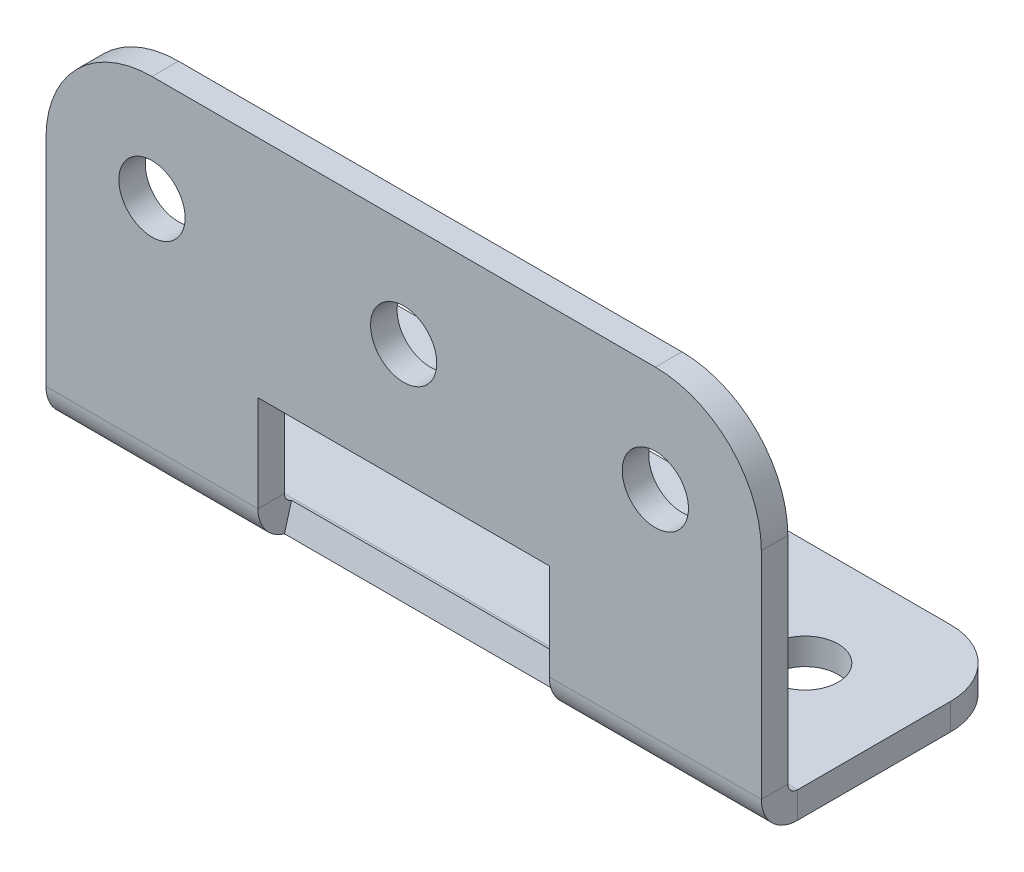
ISO-10303-21;
HEADER;
FILE_DESCRIPTION(('STEP AP214'),'2;1');
FILE_NAME('part.step','',(''),(''),'','','');
FILE_SCHEMA(('AUTOMOTIVE_DESIGN { 1 0 10303 214 1 1 1 1 }'));
ENDSEC;
DATA;
#1=APPLICATION_CONTEXT('core data for automotive mechanical design processes');
#2=APPLICATION_PROTOCOL_DEFINITION('international standard','automotive_design',2000,#1);
#3=PRODUCT_CONTEXT('',#1,'mechanical');
#4=PRODUCT('Part','Part','',(#3));
#5=PRODUCT_RELATED_PRODUCT_CATEGORY('part','',(#4));
#6=PRODUCT_DEFINITION_FORMATION('','',#4);
#7=PRODUCT_DEFINITION_CONTEXT('part definition',#1,'design');
#8=PRODUCT_DEFINITION('design','',#6,#7);
#9=PRODUCT_DEFINITION_SHAPE('','',#8);
#10=(LENGTH_UNIT() NAMED_UNIT(*) SI_UNIT(.MILLI.,.METRE.));
#11=(NAMED_UNIT(*) PLANE_ANGLE_UNIT() SI_UNIT($,.RADIAN.));
#12=(NAMED_UNIT(*) SI_UNIT($,.STERADIAN.) SOLID_ANGLE_UNIT());
#13=UNCERTAINTY_MEASURE_WITH_UNIT(LENGTH_MEASURE(1.E-05),#10,'distance_accuracy_value','');
#14=(GEOMETRIC_REPRESENTATION_CONTEXT(3) GLOBAL_UNCERTAINTY_ASSIGNED_CONTEXT((#13)) GLOBAL_UNIT_ASSIGNED_CONTEXT((#10,
#11,#12)) REPRESENTATION_CONTEXT('',''));
#15=CARTESIAN_POINT('',(0.,0.,0.));
#16=DIRECTION('',(0.,0.,1.));
#17=DIRECTION('',(1.,0.,0.));
#18=AXIS2_PLACEMENT_3D('',#15,#16,#17);
#19=CARTESIAN_POINT('',(0.,0.,2.));
#20=DIRECTION('',(0.,0.,-1.));
#21=DIRECTION('',(-1.,0.,0.));
#22=AXIS2_PLACEMENT_3D('',#19,#20,#21);
#23=PLANE('',#22);
#24=DIRECTION('',(0.,1.,0.));
#25=VECTOR('',#24,1.);
#26=CARTESIAN_POINT('',(54.,25.,2.));
#27=LINE('',#26,#25);
#28=CARTESIAN_POINT('',(54.,0.736599999999997,2.));
#29=VERTEX_POINT('',#28);
#30=CARTESIAN_POINT('',(54.,17.,2.));
#31=VERTEX_POINT('',#30);
#32=EDGE_CURVE('E237',#29,#31,#27,.T.);
#33=ORIENTED_EDGE('',*,*,#32,.T.);
#34=CARTESIAN_POINT('',(46.,17.,2.));
#35=DIRECTION('',(0.,0.,1.));
#36=DIRECTION('',(1.,0.,0.));
#37=AXIS2_PLACEMENT_3D('',#34,#35,#36);
#38=CIRCLE('',#37,8.);
#39=CARTESIAN_POINT('',(46.,25.,2.));
#40=VERTEX_POINT('',#39);
#41=EDGE_CURVE('E392',#40,#31,#38,.F.);
#42=ORIENTED_EDGE('',*,*,#41,.F.);
#43=DIRECTION('',(-1.,0.,0.));
#44=VECTOR('',#43,1.);
#45=CARTESIAN_POINT('',(0.,25.,2.));
#46=LINE('',#45,#44);
#47=CARTESIAN_POINT('',(8.,25.,2.));
#48=VERTEX_POINT('',#47);
#49=EDGE_CURVE('E241',#40,#48,#46,.T.);
#50=ORIENTED_EDGE('',*,*,#49,.T.);
#51=CARTESIAN_POINT('',(8.,17.,2.));
#52=DIRECTION('',(0.,0.,1.));
#53=DIRECTION('',(1.,0.,0.));
#54=AXIS2_PLACEMENT_3D('',#51,#52,#53);
#55=CIRCLE('',#54,8.);
#56=CARTESIAN_POINT('',(0.,17.,2.));
#57=VERTEX_POINT('',#56);
#58=EDGE_CURVE('E371',#57,#48,#55,.F.);
#59=ORIENTED_EDGE('',*,*,#58,.F.);
#60=DIRECTION('',(0.,-1.,0.));
#61=VECTOR('',#60,1.);
#62=CARTESIAN_POINT('',(0.,0.,2.));
#63=LINE('',#62,#61);
#64=CARTESIAN_POINT('',(0.,0.736599999999997,2.));
#65=VERTEX_POINT('',#64);
#66=EDGE_CURVE('E235',#57,#65,#63,.T.);
#67=ORIENTED_EDGE('',*,*,#66,.T.);
#68=DIRECTION('',(-1.,0.,0.));
#69=VECTOR('',#68,1.);
#70=CARTESIAN_POINT('',(0.,0.736599999999997,2.));
#71=LINE('',#70,#69);
#72=CARTESIAN_POINT('',(16.,0.736600000000008,2.));
#73=VERTEX_POINT('',#72);
#74=EDGE_CURVE('E229',#73,#65,#71,.T.);
#75=ORIENTED_EDGE('',*,*,#74,.F.);
#76=DIRECTION('',(0.,1.,0.));
#77=VECTOR('',#76,1.);
#78=CARTESIAN_POINT('',(16.,-25.,2.));
#79=LINE('',#78,#77);
#80=CARTESIAN_POINT('',(16.,8.,2.));
#81=VERTEX_POINT('',#80);
#82=EDGE_CURVE('E216',#73,#81,#79,.T.);
#83=ORIENTED_EDGE('',*,*,#82,.T.);
#84=DIRECTION('',(1.,0.,0.));
#85=VECTOR('',#84,1.);
#86=CARTESIAN_POINT('',(0.,8.,2.));
#87=LINE('',#86,#85);
#88=CARTESIAN_POINT('',(38.,8.,2.));
#89=VERTEX_POINT('',#88);
#90=EDGE_CURVE('E194',#81,#89,#87,.T.);
#91=ORIENTED_EDGE('',*,*,#90,.T.);
#92=DIRECTION('',(0.,1.,0.));
#93=VECTOR('',#92,1.);
#94=CARTESIAN_POINT('',(38.,-25.,2.));
#95=LINE('',#94,#93);
#96=CARTESIAN_POINT('',(38.,0.736600000000008,2.));
#97=VERTEX_POINT('',#96);
#98=EDGE_CURVE('E85',#97,#89,#95,.T.);
#99=ORIENTED_EDGE('',*,*,#98,.F.);
#100=EDGE_CURVE('E231',#29,#97,#71,.T.);
#101=ORIENTED_EDGE('',*,*,#100,.F.);
#102=EDGE_LOOP('',(#33,#42,#50,#59,#67,#75,#83,#91,#99,#101));
#103=FACE_BOUND('',#102,.T.);
#104=CARTESIAN_POINT('',(46.,17.,2.));
#105=DIRECTION('',(0.,0.,1.));
#106=DIRECTION('',(1.,0.,0.));
#107=AXIS2_PLACEMENT_3D('',#104,#105,#106);
#108=CIRCLE('',#107,2.5);
#109=CARTESIAN_POINT('',(48.5,17.,2.));
#110=VERTEX_POINT('',#109);
#111=EDGE_CURVE('E391',#110,#110,#108,.T.);
#112=ORIENTED_EDGE('',*,*,#111,.F.);
#113=EDGE_LOOP('',(#112));
#114=FACE_BOUND('',#113,.T.);
#115=CARTESIAN_POINT('',(27.,17.,2.));
#116=DIRECTION('',(0.,0.,1.));
#117=DIRECTION('',(1.,0.,0.));
#118=AXIS2_PLACEMENT_3D('',#115,#116,#117);
#119=CIRCLE('',#118,2.5);
#120=CARTESIAN_POINT('',(29.5,17.,2.));
#121=VERTEX_POINT('',#120);
#122=EDGE_CURVE('E406',#121,#121,#119,.T.);
#123=ORIENTED_EDGE('',*,*,#122,.F.);
#124=EDGE_LOOP('',(#123));
#125=FACE_BOUND('',#124,.T.);
#126=CARTESIAN_POINT('',(8.,17.,2.));
#127=DIRECTION('',(0.,0.,1.));
#128=DIRECTION('',(1.,0.,0.));
#129=AXIS2_PLACEMENT_3D('',#126,#127,#128);
#130=CIRCLE('',#129,2.5);
#131=CARTESIAN_POINT('',(10.5,17.,2.));
#132=VERTEX_POINT('',#131);
#133=EDGE_CURVE('E395',#132,#132,#130,.T.);
#134=ORIENTED_EDGE('',*,*,#133,.F.);
#135=EDGE_LOOP('',(#134));
#136=FACE_BOUND('',#135,.T.);
#137=ADVANCED_FACE('F63',(#103,#114,#125,#136),#23,.F.);
#138=CARTESIAN_POINT('',(0.,0.,0.));
#139=DIRECTION('',(0.,0.,-1.));
#140=DIRECTION('',(-1.,0.,0.));
#141=AXIS2_PLACEMENT_3D('',#138,#139,#140);
#142=PLANE('',#141);
#143=CARTESIAN_POINT('',(46.,17.,0.));
#144=DIRECTION('',(0.,0.,-1.));
#145=DIRECTION('',(-1.,0.,0.));
#146=AXIS2_PLACEMENT_3D('',#143,#144,#145);
#147=CIRCLE('',#146,8.);
#148=CARTESIAN_POINT('',(54.,17.,0.));
#149=VERTEX_POINT('',#148);
#150=CARTESIAN_POINT('',(46.,25.,0.));
#151=VERTEX_POINT('',#150);
#152=EDGE_CURVE('E329',#149,#151,#147,.F.);
#153=ORIENTED_EDGE('',*,*,#152,.F.);
#154=DIRECTION('',(0.,1.,0.));
#155=VECTOR('',#154,1.);
#156=CARTESIAN_POINT('',(54.,25.,0.));
#157=LINE('',#156,#155);
#158=CARTESIAN_POINT('',(54.,0.736599999999997,0.));
#159=VERTEX_POINT('',#158);
#160=EDGE_CURVE('E246',#159,#149,#157,.T.);
#161=ORIENTED_EDGE('',*,*,#160,.F.);
#162=DIRECTION('',(1.,0.,0.));
#163=VECTOR('',#162,1.);
#164=CARTESIAN_POINT('',(0.,0.736599999999997,0.));
#165=LINE('',#164,#163);
#166=CARTESIAN_POINT('',(38.,0.736600000000008,0.));
#167=VERTEX_POINT('',#166);
#168=EDGE_CURVE('E219',#167,#159,#165,.T.);
#169=ORIENTED_EDGE('',*,*,#168,.F.);
#170=DIRECTION('',(0.,1.,0.));
#171=VECTOR('',#170,1.);
#172=CARTESIAN_POINT('',(38.,0.,0.));
#173=LINE('',#172,#171);
#174=CARTESIAN_POINT('',(38.,8.,0.));
#175=VERTEX_POINT('',#174);
#176=EDGE_CURVE('E209',#167,#175,#173,.T.);
#177=ORIENTED_EDGE('',*,*,#176,.T.);
#178=DIRECTION('',(1.,0.,0.));
#179=VECTOR('',#178,1.);
#180=CARTESIAN_POINT('',(0.,8.,0.));
#181=LINE('',#180,#179);
#182=CARTESIAN_POINT('',(16.,8.,0.));
#183=VERTEX_POINT('',#182);
#184=EDGE_CURVE('E192',#183,#175,#181,.T.);
#185=ORIENTED_EDGE('',*,*,#184,.F.);
#186=DIRECTION('',(0.,1.,0.));
#187=VECTOR('',#186,1.);
#188=CARTESIAN_POINT('',(16.,0.,0.));
#189=LINE('',#188,#187);
#190=CARTESIAN_POINT('',(16.,0.736600000000007,0.));
#191=VERTEX_POINT('',#190);
#192=EDGE_CURVE('E206',#191,#183,#189,.T.);
#193=ORIENTED_EDGE('',*,*,#192,.F.);
#194=CARTESIAN_POINT('',(0.,0.736599999999997,0.));
#195=VERTEX_POINT('',#194);
#196=EDGE_CURVE('E225',#195,#191,#165,.T.);
#197=ORIENTED_EDGE('',*,*,#196,.F.);
#198=DIRECTION('',(0.,-1.,0.));
#199=VECTOR('',#198,1.);
#200=CARTESIAN_POINT('',(0.,0.,0.));
#201=LINE('',#200,#199);
#202=CARTESIAN_POINT('',(0.,17.,0.));
#203=VERTEX_POINT('',#202);
#204=EDGE_CURVE('E234',#203,#195,#201,.T.);
#205=ORIENTED_EDGE('',*,*,#204,.F.);
#206=CARTESIAN_POINT('',(8.,17.,0.));
#207=DIRECTION('',(0.,0.,-1.));
#208=DIRECTION('',(-1.,0.,0.));
#209=AXIS2_PLACEMENT_3D('',#206,#207,#208);
#210=CIRCLE('',#209,8.);
#211=CARTESIAN_POINT('',(8.,25.,0.));
#212=VERTEX_POINT('',#211);
#213=EDGE_CURVE('E324',#212,#203,#210,.F.);
#214=ORIENTED_EDGE('',*,*,#213,.F.);
#215=DIRECTION('',(-1.,0.,0.));
#216=VECTOR('',#215,1.);
#217=CARTESIAN_POINT('',(0.,25.,0.));
#218=LINE('',#217,#216);
#219=EDGE_CURVE('E238',#151,#212,#218,.T.);
#220=ORIENTED_EDGE('',*,*,#219,.F.);
#221=EDGE_LOOP('',(#153,#161,#169,#177,#185,#193,#197,#205,#214,#220));
#222=FACE_BOUND('',#221,.T.);
#223=CARTESIAN_POINT('',(46.,17.,0.));
#224=DIRECTION('',(0.,0.,-1.));
#225=DIRECTION('',(-1.,0.,0.));
#226=AXIS2_PLACEMENT_3D('',#223,#224,#225);
#227=CIRCLE('',#226,2.5);
#228=CARTESIAN_POINT('',(43.5,17.,0.));
#229=VERTEX_POINT('',#228);
#230=EDGE_CURVE('E322',#229,#229,#227,.T.);
#231=ORIENTED_EDGE('',*,*,#230,.F.);
#232=EDGE_LOOP('',(#231));
#233=FACE_BOUND('',#232,.T.);
#234=CARTESIAN_POINT('',(27.,17.,0.));
#235=DIRECTION('',(0.,0.,1.));
#236=DIRECTION('',(1.,0.,0.));
#237=AXIS2_PLACEMENT_3D('',#234,#235,#236);
#238=CIRCLE('',#237,2.5);
#239=CARTESIAN_POINT('',(29.5,17.,0.));
#240=VERTEX_POINT('',#239);
#241=EDGE_CURVE('E210',#240,#240,#238,.T.);
#242=ORIENTED_EDGE('',*,*,#241,.T.);
#243=EDGE_LOOP('',(#242));
#244=FACE_BOUND('',#243,.T.);
#245=CARTESIAN_POINT('',(8.,17.,0.));
#246=DIRECTION('',(0.,0.,-1.));
#247=DIRECTION('',(-1.,0.,0.));
#248=AXIS2_PLACEMENT_3D('',#245,#246,#247);
#249=CIRCLE('',#248,2.5);
#250=CARTESIAN_POINT('',(5.5,17.,0.));
#251=VERTEX_POINT('',#250);
#252=EDGE_CURVE('E67',#251,#251,#249,.T.);
#253=ORIENTED_EDGE('',*,*,#252,.F.);
#254=EDGE_LOOP('',(#253));
#255=FACE_BOUND('',#254,.T.);
#256=ADVANCED_FACE('F203',(#222,#233,#244,#255),#142,.T.);
#257=CARTESIAN_POINT('',(54.,25.,2.));
#258=DIRECTION('',(-1.,0.,0.));
#259=DIRECTION('',(0.,0.,1.));
#260=AXIS2_PLACEMENT_3D('',#257,#258,#259);
#261=PLANE('',#260);
#262=DIRECTION('',(0.,0.,1.));
#263=VECTOR('',#262,1.);
#264=CARTESIAN_POINT('',(54.,17.,-8.));
#265=LINE('',#264,#263);
#266=EDGE_CURVE('E72',#31,#149,#265,.F.);
#267=ORIENTED_EDGE('',*,*,#266,.F.);
#268=ORIENTED_EDGE('',*,*,#32,.F.);
#269=DIRECTION('',(0.,0.,1.));
#270=VECTOR('',#269,1.);
#271=CARTESIAN_POINT('',(54.,0.736599999999997,0.));
#272=LINE('',#271,#270);
#273=EDGE_CURVE('E227',#159,#29,#272,.T.);
#274=ORIENTED_EDGE('',*,*,#273,.F.);
#275=ORIENTED_EDGE('',*,*,#160,.T.);
#276=EDGE_LOOP('',(#267,#268,#274,#275));
#277=FACE_BOUND('',#276,.T.);
#278=ADVANCED_FACE('F427',(#277),#261,.F.);
#279=CARTESIAN_POINT('',(54.,0.736599999999997,-0.736599999999999));
#280=DIRECTION('',(1.,0.,0.));
#281=DIRECTION('',(0.,0.,1.));
#282=AXIS2_PLACEMENT_3D('',#279,#280,#281);
#283=CYLINDRICAL_SURFACE('',#282,2.7366);
#284=DIRECTION('',(-1.,0.,0.));
#285=VECTOR('',#284,1.);
#286=CARTESIAN_POINT('',(38.,-1.89900239793486,0.));
#287=LINE('',#286,#285);
#288=CARTESIAN_POINT('',(38.,-1.89900239793486,0.));
#289=VERTEX_POINT('',#288);
#290=CARTESIAN_POINT('',(16.,-1.89900239793486,0.));
#291=VERTEX_POINT('',#290);
#292=EDGE_CURVE('E354',#289,#291,#287,.T.);
#293=ORIENTED_EDGE('',*,*,#292,.T.);
#294=CARTESIAN_POINT('',(16.,0.736599999999999,-0.736599999999998));
#295=DIRECTION('',(-1.,0.,0.));
#296=DIRECTION('',(0.,0.,1.));
#297=AXIS2_PLACEMENT_3D('',#294,#295,#296);
#298=CIRCLE('',#297,2.7366);
#299=EDGE_CURVE('E221',#291,#73,#298,.T.);
#300=ORIENTED_EDGE('',*,*,#299,.T.);
#301=ORIENTED_EDGE('',*,*,#74,.T.);
#302=CARTESIAN_POINT('',(0.,0.736599999999997,-0.736599999999999));
#303=DIRECTION('',(1.,0.,0.));
#304=DIRECTION('',(0.,0.,-1.));
#305=AXIS2_PLACEMENT_3D('',#302,#303,#304);
#306=CIRCLE('',#305,2.7366);
#307=CARTESIAN_POINT('',(0.,-2.,-0.736599999999999));
#308=VERTEX_POINT('',#307);
#309=EDGE_CURVE('E254',#308,#65,#306,.F.);
#310=ORIENTED_EDGE('',*,*,#309,.F.);
#311=DIRECTION('',(1.,0.,0.));
#312=VECTOR('',#311,1.);
#313=CARTESIAN_POINT('',(54.,-2.,-0.736599999999998));
#314=LINE('',#313,#312);
#315=CARTESIAN_POINT('',(54.,-2.,-0.736599999999998));
#316=VERTEX_POINT('',#315);
#317=EDGE_CURVE('E251',#316,#308,#314,.F.);
#318=ORIENTED_EDGE('',*,*,#317,.F.);
#319=CARTESIAN_POINT('',(54.,0.736599999999997,-0.736599999999999));
#320=DIRECTION('',(1.,0.,0.));
#321=DIRECTION('',(0.,0.,-1.));
#322=AXIS2_PLACEMENT_3D('',#319,#320,#321);
#323=CIRCLE('',#322,2.7366);
#324=EDGE_CURVE('E255',#29,#316,#323,.T.);
#325=ORIENTED_EDGE('',*,*,#324,.F.);
#326=ORIENTED_EDGE('',*,*,#100,.T.);
#327=CARTESIAN_POINT('',(38.,0.736599999999999,-0.736599999999998));
#328=DIRECTION('',(1.,0.,0.));
#329=DIRECTION('',(0.,0.,-1.));
#330=AXIS2_PLACEMENT_3D('',#327,#328,#329);
#331=CIRCLE('',#330,2.7366);
#332=EDGE_CURVE('E346',#97,#289,#331,.T.);
#333=ORIENTED_EDGE('',*,*,#332,.T.);
#334=EDGE_LOOP('',(#293,#300,#301,#310,#318,#325,#326,#333));
#335=FACE_BOUND('',#334,.T.);
#336=ADVANCED_FACE('F364',(#335),#283,.T.);
#337=CARTESIAN_POINT('',(54.,0.736599999999997,-0.736599999999999));
#338=DIRECTION('',(1.,0.,0.));
#339=DIRECTION('',(0.,0.,1.));
#340=AXIS2_PLACEMENT_3D('',#337,#338,#339);
#341=CYLINDRICAL_SURFACE('',#340,0.736599999999999);
#342=CARTESIAN_POINT('',(16.,0.736599999999999,-0.736599999999998));
#343=DIRECTION('',(-1.,0.,0.));
#344=DIRECTION('',(0.,0.,1.));
#345=AXIS2_PLACEMENT_3D('',#342,#343,#344);
#346=CIRCLE('',#345,0.7366);
#347=CARTESIAN_POINT('',(16.,0.0271851325298461,-0.538332237082509));
#348=VERTEX_POINT('',#347);
#349=EDGE_CURVE('E357',#348,#191,#346,.T.);
#350=ORIENTED_EDGE('',*,*,#349,.F.);
#351=DIRECTION('',(-1.,0.,0.));
#352=VECTOR('',#351,1.);
#353=CARTESIAN_POINT('',(81.0909038411103,0.0271851325298461,-0.538332237082509));
#354=LINE('',#353,#352);
#355=CARTESIAN_POINT('',(38.,0.0271851325298461,-0.538332237082509));
#356=VERTEX_POINT('',#355);
#357=EDGE_CURVE('E349',#356,#348,#354,.T.);
#358=ORIENTED_EDGE('',*,*,#357,.F.);
#359=CARTESIAN_POINT('',(38.,0.736599999999999,-0.736599999999998));
#360=DIRECTION('',(-1.,0.,0.));
#361=DIRECTION('',(0.,0.,1.));
#362=AXIS2_PLACEMENT_3D('',#359,#360,#361);
#363=CIRCLE('',#362,0.7366);
#364=EDGE_CURVE('E341',#167,#356,#363,.F.);
#365=ORIENTED_EDGE('',*,*,#364,.F.);
#366=ORIENTED_EDGE('',*,*,#168,.T.);
#367=CARTESIAN_POINT('',(54.,0.736599999999997,-0.736599999999999));
#368=DIRECTION('',(1.,0.,0.));
#369=DIRECTION('',(0.,0.,-1.));
#370=AXIS2_PLACEMENT_3D('',#367,#368,#369);
#371=CIRCLE('',#370,0.736599999999999);
#372=CARTESIAN_POINT('',(54.,0.,-0.736599999999999));
#373=VERTEX_POINT('',#372);
#374=EDGE_CURVE('E244',#159,#373,#371,.T.);
#375=ORIENTED_EDGE('',*,*,#374,.T.);
#376=DIRECTION('',(1.,0.,0.));
#377=VECTOR('',#376,1.);
#378=CARTESIAN_POINT('',(54.,0.,-0.736599999999999));
#379=LINE('',#378,#377);
#380=CARTESIAN_POINT('',(0.,0.,-0.736599999999999));
#381=VERTEX_POINT('',#380);
#382=EDGE_CURVE('E264',#373,#381,#379,.F.);
#383=ORIENTED_EDGE('',*,*,#382,.T.);
#384=CARTESIAN_POINT('',(0.,0.736599999999997,-0.736599999999999));
#385=DIRECTION('',(1.,0.,0.));
#386=DIRECTION('',(0.,0.,-1.));
#387=AXIS2_PLACEMENT_3D('',#384,#385,#386);
#388=CIRCLE('',#387,0.736599999999999);
#389=EDGE_CURVE('E261',#381,#195,#388,.F.);
#390=ORIENTED_EDGE('',*,*,#389,.T.);
#391=ORIENTED_EDGE('',*,*,#196,.T.);
#392=EDGE_LOOP('',(#350,#358,#365,#366,#375,#383,#390,#391));
#393=FACE_BOUND('',#392,.T.);
#394=ADVANCED_FACE('F381',(#393),#341,.F.);
#395=CARTESIAN_POINT('',(0.,25.,2.));
#396=DIRECTION('',(0.,-1.,0.));
#397=DIRECTION('',(0.,0.,-1.));
#398=AXIS2_PLACEMENT_3D('',#395,#396,#397);
#399=PLANE('',#398);
#400=ORIENTED_EDGE('',*,*,#49,.F.);
#401=DIRECTION('',(0.,0.,1.));
#402=VECTOR('',#401,1.);
#403=CARTESIAN_POINT('',(46.,25.,-8.));
#404=LINE('',#403,#402);
#405=EDGE_CURVE('E388',#151,#40,#404,.T.);
#406=ORIENTED_EDGE('',*,*,#405,.F.);
#407=ORIENTED_EDGE('',*,*,#219,.T.);
#408=DIRECTION('',(0.,0.,1.));
#409=VECTOR('',#408,1.);
#410=CARTESIAN_POINT('',(8.,25.,-8.));
#411=LINE('',#410,#409);
#412=EDGE_CURVE('E334',#212,#48,#411,.T.);
#413=ORIENTED_EDGE('',*,*,#412,.T.);
#414=EDGE_LOOP('',(#400,#406,#407,#413));
#415=FACE_BOUND('',#414,.T.);
#416=ADVANCED_FACE('F386',(#415),#399,.F.);
#417=CARTESIAN_POINT('',(54.,-2.,0.));
#418=DIRECTION('',(1.,0.,0.));
#419=DIRECTION('',(0.,0.,-1.));
#420=AXIS2_PLACEMENT_3D('',#417,#418,#419);
#421=PLANE('',#420);
#422=DIRECTION('',(0.,0.,-1.));
#423=VECTOR('',#422,1.);
#424=CARTESIAN_POINT('',(54.,0.,0.));
#425=LINE('',#424,#423);
#426=CARTESIAN_POINT('',(54.,0.,-12.3));
#427=VERTEX_POINT('',#426);
#428=EDGE_CURVE('E304',#373,#427,#425,.T.);
#429=ORIENTED_EDGE('',*,*,#428,.F.);
#430=DIRECTION('',(0.,-1.,0.));
#431=VECTOR('',#430,1.);
#432=CARTESIAN_POINT('',(54.,0.,-0.736599999999999));
#433=LINE('',#432,#431);
#434=EDGE_CURVE('E258',#373,#316,#433,.T.);
#435=ORIENTED_EDGE('',*,*,#434,.T.);
#436=DIRECTION('',(0.,0.,-1.));
#437=VECTOR('',#436,1.);
#438=CARTESIAN_POINT('',(54.,-2.,0.));
#439=LINE('',#438,#437);
#440=CARTESIAN_POINT('',(54.,-2.,-12.3));
#441=VERTEX_POINT('',#440);
#442=EDGE_CURVE('E289',#316,#441,#439,.T.);
#443=ORIENTED_EDGE('',*,*,#442,.T.);
#444=DIRECTION('',(0.,1.,0.));
#445=VECTOR('',#444,1.);
#446=CARTESIAN_POINT('',(54.,-2.,-12.3));
#447=LINE('',#446,#445);
#448=EDGE_CURVE('E301',#441,#427,#447,.T.);
#449=ORIENTED_EDGE('',*,*,#448,.T.);
#450=EDGE_LOOP('',(#429,#435,#443,#449));
#451=FACE_BOUND('',#450,.T.);
#452=ADVANCED_FACE('F434',(#451),#421,.T.);
#453=CARTESIAN_POINT('',(4.99999999999999,-2.,-12.3));
#454=DIRECTION('',(0.,-1.,0.));
#455=DIRECTION('',(0.,0.,-1.));
#456=AXIS2_PLACEMENT_3D('',#453,#454,#455);
#457=PLANE('',#456);
#458=CARTESIAN_POINT('',(46.,-2.,-9.3));
#459=DIRECTION('',(0.,1.,0.));
#460=DIRECTION('',(0.,0.,-1.));
#461=AXIS2_PLACEMENT_3D('',#458,#459,#460);
#462=CIRCLE('',#461,2.5);
#463=CARTESIAN_POINT('',(46.,-2.,-11.8));
#464=VERTEX_POINT('',#463);
#465=EDGE_CURVE('E274',#464,#464,#462,.T.);
#466=ORIENTED_EDGE('',*,*,#465,.T.);
#467=EDGE_LOOP('',(#466));
#468=FACE_BOUND('',#467,.T.);
#469=CARTESIAN_POINT('',(8.,-2.,-9.3));
#470=DIRECTION('',(0.,1.,0.));
#471=DIRECTION('',(0.,0.,1.));
#472=AXIS2_PLACEMENT_3D('',#469,#470,#471);
#473=CIRCLE('',#472,2.5);
#474=CARTESIAN_POINT('',(8.,-2.,-6.8));
#475=VERTEX_POINT('',#474);
#476=EDGE_CURVE('E280',#475,#475,#473,.T.);
#477=ORIENTED_EDGE('',*,*,#476,.T.);
#478=EDGE_LOOP('',(#477));
#479=FACE_BOUND('',#478,.T.);
#480=ORIENTED_EDGE('',*,*,#442,.F.);
#481=ORIENTED_EDGE('',*,*,#317,.T.);
#482=DIRECTION('',(0.,0.,1.));
#483=VECTOR('',#482,1.);
#484=CARTESIAN_POINT('',(0.,-2.,0.));
#485=LINE('',#484,#483);
#486=CARTESIAN_POINT('',(0.,-2.,-12.3));
#487=VERTEX_POINT('',#486);
#488=EDGE_CURVE('E286',#487,#308,#485,.T.);
#489=ORIENTED_EDGE('',*,*,#488,.F.);
#490=CARTESIAN_POINT('',(4.99999999999999,-2.,-12.3));
#491=DIRECTION('',(0.,1.,0.));
#492=DIRECTION('',(0.,0.,-1.));
#493=AXIS2_PLACEMENT_3D('',#490,#491,#492);
#494=CIRCLE('',#493,4.99999999999999);
#495=CARTESIAN_POINT('',(4.99999999999999,-2.,-17.3));
#496=VERTEX_POINT('',#495);
#497=EDGE_CURVE('E298',#496,#487,#494,.T.);
#498=ORIENTED_EDGE('',*,*,#497,.F.);
#499=DIRECTION('',(-1.,0.,0.));
#500=VECTOR('',#499,1.);
#501=CARTESIAN_POINT('',(4.99999999999999,-2.,-17.3));
#502=LINE('',#501,#500);
#503=CARTESIAN_POINT('',(49.,-2.,-17.3));
#504=VERTEX_POINT('',#503);
#505=EDGE_CURVE('E295',#504,#496,#502,.T.);
#506=ORIENTED_EDGE('',*,*,#505,.F.);
#507=CARTESIAN_POINT('',(49.,-2.,-12.3));
#508=DIRECTION('',(0.,1.,0.));
#509=DIRECTION('',(0.,0.,-1.));
#510=AXIS2_PLACEMENT_3D('',#507,#508,#509);
#511=CIRCLE('',#510,4.99999999999999);
#512=EDGE_CURVE('E292',#441,#504,#511,.T.);
#513=ORIENTED_EDGE('',*,*,#512,.F.);
#514=EDGE_LOOP('',(#480,#481,#489,#498,#506,#513));
#515=FACE_BOUND('',#514,.T.);
#516=ADVANCED_FACE('F459',(#468,#479,#515),#457,.T.);
#517=CARTESIAN_POINT('',(4.99999999999999,0.,-12.3));
#518=DIRECTION('',(0.,-1.,0.));
#519=DIRECTION('',(0.,0.,-1.));
#520=AXIS2_PLACEMENT_3D('',#517,#518,#519);
#521=PLANE('',#520);
#522=CARTESIAN_POINT('',(8.,0.,-9.3));
#523=DIRECTION('',(0.,1.,0.));
#524=DIRECTION('',(0.,0.,1.));
#525=AXIS2_PLACEMENT_3D('',#522,#523,#524);
#526=CIRCLE('',#525,2.5);
#527=CARTESIAN_POINT('',(8.,0.,-6.8));
#528=VERTEX_POINT('',#527);
#529=EDGE_CURVE('E277',#528,#528,#526,.T.);
#530=ORIENTED_EDGE('',*,*,#529,.F.);
#531=EDGE_LOOP('',(#530));
#532=FACE_BOUND('',#531,.T.);
#533=CARTESIAN_POINT('',(46.,0.,-9.3));
#534=DIRECTION('',(0.,1.,0.));
#535=DIRECTION('',(0.,0.,-1.));
#536=AXIS2_PLACEMENT_3D('',#533,#534,#535);
#537=CIRCLE('',#536,2.5);
#538=CARTESIAN_POINT('',(46.,0.,-11.8));
#539=VERTEX_POINT('',#538);
#540=EDGE_CURVE('E271',#539,#539,#537,.T.);
#541=ORIENTED_EDGE('',*,*,#540,.F.);
#542=EDGE_LOOP('',(#541));
#543=FACE_BOUND('',#542,.T.);
#544=ORIENTED_EDGE('',*,*,#382,.F.);
#545=ORIENTED_EDGE('',*,*,#428,.T.);
#546=CARTESIAN_POINT('',(49.,0.,-12.3));
#547=DIRECTION('',(0.,1.,0.));
#548=DIRECTION('',(0.,0.,-1.));
#549=AXIS2_PLACEMENT_3D('',#546,#547,#548);
#550=CIRCLE('',#549,4.99999999999999);
#551=CARTESIAN_POINT('',(49.,0.,-17.3));
#552=VERTEX_POINT('',#551);
#553=EDGE_CURVE('E306',#427,#552,#550,.T.);
#554=ORIENTED_EDGE('',*,*,#553,.T.);
#555=DIRECTION('',(-1.,0.,0.));
#556=VECTOR('',#555,1.);
#557=CARTESIAN_POINT('',(4.99999999999999,0.,-17.3));
#558=LINE('',#557,#556);
#559=CARTESIAN_POINT('',(4.99999999999999,0.,-17.3));
#560=VERTEX_POINT('',#559);
#561=EDGE_CURVE('E309',#552,#560,#558,.T.);
#562=ORIENTED_EDGE('',*,*,#561,.T.);
#563=CARTESIAN_POINT('',(4.99999999999999,0.,-12.3));
#564=DIRECTION('',(0.,1.,0.));
#565=DIRECTION('',(0.,0.,-1.));
#566=AXIS2_PLACEMENT_3D('',#563,#564,#565);
#567=CIRCLE('',#566,4.99999999999999);
#568=CARTESIAN_POINT('',(0.,0.,-12.3));
#569=VERTEX_POINT('',#568);
#570=EDGE_CURVE('E290',#560,#569,#567,.T.);
#571=ORIENTED_EDGE('',*,*,#570,.T.);
#572=DIRECTION('',(0.,0.,1.));
#573=VECTOR('',#572,1.);
#574=CARTESIAN_POINT('',(0.,0.,0.));
#575=LINE('',#574,#573);
#576=EDGE_CURVE('E283',#569,#381,#575,.T.);
#577=ORIENTED_EDGE('',*,*,#576,.T.);
#578=EDGE_LOOP('',(#544,#545,#554,#562,#571,#577));
#579=FACE_BOUND('',#578,.T.);
#580=ADVANCED_FACE('F462',(#532,#543,#579),#521,.F.);
#581=CARTESIAN_POINT('',(0.,-2.,0.));
#582=DIRECTION('',(-1.,0.,0.));
#583=DIRECTION('',(0.,0.,1.));
#584=AXIS2_PLACEMENT_3D('',#581,#582,#583);
#585=PLANE('',#584);
#586=DIRECTION('',(0.,-1.,0.));
#587=VECTOR('',#586,1.);
#588=CARTESIAN_POINT('',(0.,0.,-0.736599999999999));
#589=LINE('',#588,#587);
#590=EDGE_CURVE('E268',#381,#308,#589,.T.);
#591=ORIENTED_EDGE('',*,*,#590,.F.);
#592=ORIENTED_EDGE('',*,*,#576,.F.);
#593=DIRECTION('',(0.,1.,0.));
#594=VECTOR('',#593,1.);
#595=CARTESIAN_POINT('',(0.,-2.,-12.3));
#596=LINE('',#595,#594);
#597=EDGE_CURVE('E314',#487,#569,#596,.T.);
#598=ORIENTED_EDGE('',*,*,#597,.F.);
#599=ORIENTED_EDGE('',*,*,#488,.T.);
#600=EDGE_LOOP('',(#591,#592,#598,#599));
#601=FACE_BOUND('',#600,.T.);
#602=ADVANCED_FACE('F65',(#601),#585,.T.);
#603=CARTESIAN_POINT('',(4.99999999999999,-2.,-12.3));
#604=DIRECTION('',(0.,1.,0.));
#605=DIRECTION('',(0.,0.,1.));
#606=AXIS2_PLACEMENT_3D('',#603,#604,#605);
#607=CYLINDRICAL_SURFACE('',#606,4.99999999999999);
#608=ORIENTED_EDGE('',*,*,#570,.F.);
#609=DIRECTION('',(0.,1.,0.));
#610=VECTOR('',#609,1.);
#611=CARTESIAN_POINT('',(4.99999999999999,-2.,-17.3));
#612=LINE('',#611,#610);
#613=EDGE_CURVE('E316',#496,#560,#612,.T.);
#614=ORIENTED_EDGE('',*,*,#613,.F.);
#615=ORIENTED_EDGE('',*,*,#497,.T.);
#616=ORIENTED_EDGE('',*,*,#597,.T.);
#617=EDGE_LOOP('',(#608,#614,#615,#616));
#618=FACE_BOUND('',#617,.T.);
#619=ADVANCED_FACE('F467',(#618),#607,.T.);
#620=CARTESIAN_POINT('',(4.99999999999999,-2.,-17.3));
#621=DIRECTION('',(0.,0.,-1.));
#622=DIRECTION('',(-1.,0.,0.));
#623=AXIS2_PLACEMENT_3D('',#620,#621,#622);
#624=PLANE('',#623);
#625=ORIENTED_EDGE('',*,*,#561,.F.);
#626=DIRECTION('',(0.,1.,0.));
#627=VECTOR('',#626,1.);
#628=CARTESIAN_POINT('',(49.,-2.,-17.3));
#629=LINE('',#628,#627);
#630=EDGE_CURVE('E318',#504,#552,#629,.T.);
#631=ORIENTED_EDGE('',*,*,#630,.F.);
#632=ORIENTED_EDGE('',*,*,#505,.T.);
#633=ORIENTED_EDGE('',*,*,#613,.T.);
#634=EDGE_LOOP('',(#625,#631,#632,#633));
#635=FACE_BOUND('',#634,.T.);
#636=ADVANCED_FACE('F470',(#635),#624,.T.);
#637=CARTESIAN_POINT('',(49.,-2.,-12.3));
#638=DIRECTION('',(0.,1.,0.));
#639=DIRECTION('',(0.,0.,1.));
#640=AXIS2_PLACEMENT_3D('',#637,#638,#639);
#641=CYLINDRICAL_SURFACE('',#640,4.99999999999999);
#642=ORIENTED_EDGE('',*,*,#553,.F.);
#643=ORIENTED_EDGE('',*,*,#448,.F.);
#644=ORIENTED_EDGE('',*,*,#512,.T.);
#645=ORIENTED_EDGE('',*,*,#630,.T.);
#646=EDGE_LOOP('',(#642,#643,#644,#645));
#647=FACE_BOUND('',#646,.T.);
#648=ADVANCED_FACE('F457',(#647),#641,.T.);
#649=CARTESIAN_POINT('',(8.,-2.,-9.3));
#650=DIRECTION('',(0.,1.,0.));
#651=DIRECTION('',(0.,0.,1.));
#652=AXIS2_PLACEMENT_3D('',#649,#650,#651);
#653=CYLINDRICAL_SURFACE('',#652,2.5);
#654=ORIENTED_EDGE('',*,*,#476,.F.);
#655=EDGE_LOOP('',(#654));
#656=FACE_BOUND('',#655,.T.);
#657=ORIENTED_EDGE('',*,*,#529,.T.);
#658=EDGE_LOOP('',(#657));
#659=FACE_BOUND('',#658,.T.);
#660=ADVANCED_FACE('F453',(#656,#659),#653,.F.);
#661=CARTESIAN_POINT('',(46.,-2.,-9.3));
#662=DIRECTION('',(0.,1.,0.));
#663=DIRECTION('',(0.,0.,1.));
#664=AXIS2_PLACEMENT_3D('',#661,#662,#663);
#665=CYLINDRICAL_SURFACE('',#664,2.5);
#666=ORIENTED_EDGE('',*,*,#465,.F.);
#667=EDGE_LOOP('',(#666));
#668=FACE_BOUND('',#667,.T.);
#669=ORIENTED_EDGE('',*,*,#540,.T.);
#670=EDGE_LOOP('',(#669));
#671=FACE_BOUND('',#670,.T.);
#672=ADVANCED_FACE('F447',(#668,#671),#665,.F.);
#673=CARTESIAN_POINT('',(0.,0.736599999999997,-0.736599999999999));
#674=DIRECTION('',(-1.,0.,0.));
#675=DIRECTION('',(0.,0.,1.));
#676=AXIS2_PLACEMENT_3D('',#673,#674,#675);
#677=PLANE('',#676);
#678=DIRECTION('',(0.,0.,1.));
#679=VECTOR('',#678,1.);
#680=CARTESIAN_POINT('',(0.,0.736599999999997,0.));
#681=LINE('',#680,#679);
#682=EDGE_CURVE('E215',#195,#65,#681,.T.);
#683=ORIENTED_EDGE('',*,*,#682,.F.);
#684=ORIENTED_EDGE('',*,*,#389,.F.);
#685=ORIENTED_EDGE('',*,*,#590,.T.);
#686=ORIENTED_EDGE('',*,*,#309,.T.);
#687=EDGE_LOOP('',(#683,#684,#685,#686));
#688=FACE_BOUND('',#687,.T.);
#689=ADVANCED_FACE('F378',(#688),#677,.T.);
#690=CARTESIAN_POINT('',(54.,0.736599999999997,-0.736599999999999));
#691=DIRECTION('',(-1.,0.,0.));
#692=DIRECTION('',(0.,0.,1.));
#693=AXIS2_PLACEMENT_3D('',#690,#691,#692);
#694=PLANE('',#693);
#695=ORIENTED_EDGE('',*,*,#374,.F.);
#696=ORIENTED_EDGE('',*,*,#273,.T.);
#697=ORIENTED_EDGE('',*,*,#324,.T.);
#698=ORIENTED_EDGE('',*,*,#434,.F.);
#699=EDGE_LOOP('',(#695,#696,#697,#698));
#700=FACE_BOUND('',#699,.T.);
#701=ADVANCED_FACE('F440',(#700),#694,.F.);
#702=CARTESIAN_POINT('',(0.,0.,2.));
#703=DIRECTION('',(1.,0.,0.));
#704=DIRECTION('',(0.,0.,-1.));
#705=AXIS2_PLACEMENT_3D('',#702,#703,#704);
#706=PLANE('',#705);
#707=ORIENTED_EDGE('',*,*,#66,.F.);
#708=DIRECTION('',(0.,0.,1.));
#709=VECTOR('',#708,1.);
#710=CARTESIAN_POINT('',(0.,17.,-8.));
#711=LINE('',#710,#709);
#712=EDGE_CURVE('E12',#57,#203,#711,.F.);
#713=ORIENTED_EDGE('',*,*,#712,.T.);
#714=ORIENTED_EDGE('',*,*,#204,.T.);
#715=ORIENTED_EDGE('',*,*,#682,.T.);
#716=EDGE_LOOP('',(#707,#713,#714,#715));
#717=FACE_BOUND('',#716,.T.);
#718=ADVANCED_FACE('F373',(#717),#706,.F.);
#719=CARTESIAN_POINT('',(16.,-25.,2.));
#720=DIRECTION('',(-1.,0.,0.));
#721=DIRECTION('',(0.,1.,0.));
#722=AXIS2_PLACEMENT_3D('',#719,#720,#721);
#723=PLANE('',#722);
#724=DIRECTION('',(0.,0.,1.));
#725=VECTOR('',#724,1.);
#726=CARTESIAN_POINT('',(16.,8.,0.));
#727=LINE('',#726,#725);
#728=EDGE_CURVE('E189',#183,#81,#727,.T.);
#729=ORIENTED_EDGE('',*,*,#728,.T.);
#730=ORIENTED_EDGE('',*,*,#82,.F.);
#731=DIRECTION('',(0.,0.,-1.));
#732=VECTOR('',#731,1.);
#733=CARTESIAN_POINT('',(16.,0.736600000000007,2.));
#734=LINE('',#733,#732);
#735=EDGE_CURVE('E213',#73,#191,#734,.T.);
#736=ORIENTED_EDGE('',*,*,#735,.T.);
#737=ORIENTED_EDGE('',*,*,#192,.T.);
#738=EDGE_LOOP('',(#729,#730,#736,#737));
#739=FACE_BOUND('',#738,.T.);
#740=ADVANCED_FACE('F212',(#739),#723,.F.);
#741=CARTESIAN_POINT('',(16.,0.736599999999999,-0.736599999999998));
#742=DIRECTION('',(1.,0.,0.));
#743=DIRECTION('',(0.,0.,-1.));
#744=AXIS2_PLACEMENT_3D('',#741,#742,#743);
#745=PLANE('',#744);
#746=DIRECTION('',(0.,-0.963093765232355,0.269166118541257));
#747=VECTOR('',#746,1.);
#748=CARTESIAN_POINT('',(16.,-1.89900239793486,0.));
#749=LINE('',#748,#747);
#750=EDGE_CURVE('E352',#348,#291,#749,.T.);
#751=ORIENTED_EDGE('',*,*,#750,.F.);
#752=ORIENTED_EDGE('',*,*,#349,.T.);
#753=ORIENTED_EDGE('',*,*,#735,.F.);
#754=ORIENTED_EDGE('',*,*,#299,.F.);
#755=EDGE_LOOP('',(#751,#752,#753,#754));
#756=FACE_BOUND('',#755,.T.);
#757=ADVANCED_FACE('F521',(#756),#745,.T.);
#758=CARTESIAN_POINT('',(27.,-1.89900239793486,0.));
#759=DIRECTION('',(0.,0.269166118541257,0.963093765232355));
#760=DIRECTION('',(-1.,0.,0.));
#761=AXIS2_PLACEMENT_3D('',#758,#759,#760);
#762=PLANE('',#761);
#763=DIRECTION('',(0.,-0.963093765232355,0.269166118541257));
#764=VECTOR('',#763,1.);
#765=CARTESIAN_POINT('',(38.,-1.89900239793486,0.));
#766=LINE('',#765,#764);
#767=EDGE_CURVE('E344',#356,#289,#766,.T.);
#768=ORIENTED_EDGE('',*,*,#767,.F.);
#769=ORIENTED_EDGE('',*,*,#357,.T.);
#770=ORIENTED_EDGE('',*,*,#750,.T.);
#771=ORIENTED_EDGE('',*,*,#292,.F.);
#772=EDGE_LOOP('',(#768,#769,#770,#771));
#773=FACE_BOUND('',#772,.T.);
#774=ADVANCED_FACE('F515',(#773),#762,.T.);
#775=CARTESIAN_POINT('',(38.,0.736599999999999,-0.736599999999998));
#776=DIRECTION('',(-1.,0.,0.));
#777=DIRECTION('',(0.,0.,1.));
#778=AXIS2_PLACEMENT_3D('',#775,#776,#777);
#779=PLANE('',#778);
#780=DIRECTION('',(0.,0.,-1.));
#781=VECTOR('',#780,1.);
#782=CARTESIAN_POINT('',(38.,0.736600000000007,2.));
#783=LINE('',#782,#781);
#784=EDGE_CURVE('E328',#97,#167,#783,.T.);
#785=ORIENTED_EDGE('',*,*,#784,.T.);
#786=ORIENTED_EDGE('',*,*,#364,.T.);
#787=ORIENTED_EDGE('',*,*,#767,.T.);
#788=ORIENTED_EDGE('',*,*,#332,.F.);
#789=EDGE_LOOP('',(#785,#786,#787,#788));
#790=FACE_BOUND('',#789,.T.);
#791=ADVANCED_FACE('F504',(#790),#779,.T.);
#792=CARTESIAN_POINT('',(38.,-25.,2.));
#793=DIRECTION('',(-1.,0.,0.));
#794=DIRECTION('',(0.,1.,0.));
#795=AXIS2_PLACEMENT_3D('',#792,#793,#794);
#796=PLANE('',#795);
#797=DIRECTION('',(0.,0.,1.));
#798=VECTOR('',#797,1.);
#799=CARTESIAN_POINT('',(38.,8.,0.));
#800=LINE('',#799,#798);
#801=EDGE_CURVE('E80',#175,#89,#800,.T.);
#802=ORIENTED_EDGE('',*,*,#801,.F.);
#803=ORIENTED_EDGE('',*,*,#176,.F.);
#804=ORIENTED_EDGE('',*,*,#784,.F.);
#805=ORIENTED_EDGE('',*,*,#98,.T.);
#806=EDGE_LOOP('',(#802,#803,#804,#805));
#807=FACE_BOUND('',#806,.T.);
#808=ADVANCED_FACE('F506',(#807),#796,.T.);
#809=CARTESIAN_POINT('',(46.,17.,-8.));
#810=DIRECTION('',(0.,0.,1.));
#811=DIRECTION('',(1.,0.,0.));
#812=AXIS2_PLACEMENT_3D('',#809,#810,#811);
#813=CYLINDRICAL_SURFACE('',#812,8.);
#814=ORIENTED_EDGE('',*,*,#152,.T.);
#815=ORIENTED_EDGE('',*,*,#405,.T.);
#816=ORIENTED_EDGE('',*,*,#41,.T.);
#817=ORIENTED_EDGE('',*,*,#266,.T.);
#818=EDGE_LOOP('',(#814,#815,#816,#817));
#819=FACE_BOUND('',#818,.T.);
#820=ADVANCED_FACE('F500',(#819),#813,.T.);
#821=CARTESIAN_POINT('',(8.,17.,-8.));
#822=DIRECTION('',(0.,0.,1.));
#823=DIRECTION('',(1.,0.,0.));
#824=AXIS2_PLACEMENT_3D('',#821,#822,#823);
#825=CYLINDRICAL_SURFACE('',#824,8.);
#826=ORIENTED_EDGE('',*,*,#213,.T.);
#827=ORIENTED_EDGE('',*,*,#712,.F.);
#828=ORIENTED_EDGE('',*,*,#58,.T.);
#829=ORIENTED_EDGE('',*,*,#412,.F.);
#830=EDGE_LOOP('',(#826,#827,#828,#829));
#831=FACE_BOUND('',#830,.T.);
#832=ADVANCED_FACE('F513',(#831),#825,.T.);
#833=CARTESIAN_POINT('',(46.,17.,-8.));
#834=DIRECTION('',(0.,0.,1.));
#835=DIRECTION('',(1.,0.,0.));
#836=AXIS2_PLACEMENT_3D('',#833,#834,#835);
#837=CYLINDRICAL_SURFACE('',#836,2.5);
#838=ORIENTED_EDGE('',*,*,#230,.T.);
#839=EDGE_LOOP('',(#838));
#840=FACE_BOUND('',#839,.T.);
#841=ORIENTED_EDGE('',*,*,#111,.T.);
#842=EDGE_LOOP('',(#841));
#843=FACE_BOUND('',#842,.T.);
#844=ADVANCED_FACE('F683',(#840,#843),#837,.F.);
#845=CARTESIAN_POINT('',(8.,17.,-8.));
#846=DIRECTION('',(0.,0.,1.));
#847=DIRECTION('',(1.,0.,0.));
#848=AXIS2_PLACEMENT_3D('',#845,#846,#847);
#849=CYLINDRICAL_SURFACE('',#848,2.5);
#850=ORIENTED_EDGE('',*,*,#252,.T.);
#851=EDGE_LOOP('',(#850));
#852=FACE_BOUND('',#851,.T.);
#853=ORIENTED_EDGE('',*,*,#133,.T.);
#854=EDGE_LOOP('',(#853));
#855=FACE_BOUND('',#854,.T.);
#856=ADVANCED_FACE('F417',(#852,#855),#849,.F.);
#857=CARTESIAN_POINT('',(27.,17.,0.));
#858=DIRECTION('',(0.,0.,1.));
#859=DIRECTION('',(1.,0.,0.));
#860=AXIS2_PLACEMENT_3D('',#857,#858,#859);
#861=CYLINDRICAL_SURFACE('',#860,2.5);
#862=ORIENTED_EDGE('',*,*,#241,.F.);
#863=EDGE_LOOP('',(#862));
#864=FACE_BOUND('',#863,.T.);
#865=ORIENTED_EDGE('',*,*,#122,.T.);
#866=EDGE_LOOP('',(#865));
#867=FACE_BOUND('',#866,.T.);
#868=ADVANCED_FACE('F414',(#864,#867),#861,.F.);
#869=CARTESIAN_POINT('',(0.,8.,0.));
#870=DIRECTION('',(0.,-1.,0.));
#871=DIRECTION('',(0.,0.,-1.));
#872=AXIS2_PLACEMENT_3D('',#869,#870,#871);
#873=PLANE('',#872);
#874=ORIENTED_EDGE('',*,*,#90,.F.);
#875=ORIENTED_EDGE('',*,*,#728,.F.);
#876=ORIENTED_EDGE('',*,*,#184,.T.);
#877=ORIENTED_EDGE('',*,*,#801,.T.);
#878=EDGE_LOOP('',(#874,#875,#876,#877));
#879=FACE_BOUND('',#878,.T.);
#880=ADVANCED_FACE('F191',(#879),#873,.T.);
#881=CLOSED_SHELL('',(#137,#256,#278,#336,#394,#416,#452,#516,#580,#602,#619,#636,#648,#660,
#672,#689,#701,#718,#740,#757,#774,#791,#808,#820,#832,#844,#856,#868,#880));
#882=MANIFOLD_SOLID_BREP('B2',#881);
#883=ADVANCED_BREP_SHAPE_REPRESENTATION('',(#18,#882),#14);
#884=SHAPE_DEFINITION_REPRESENTATION(#9,#883);
ENDSEC;
END-ISO-10303-21;
